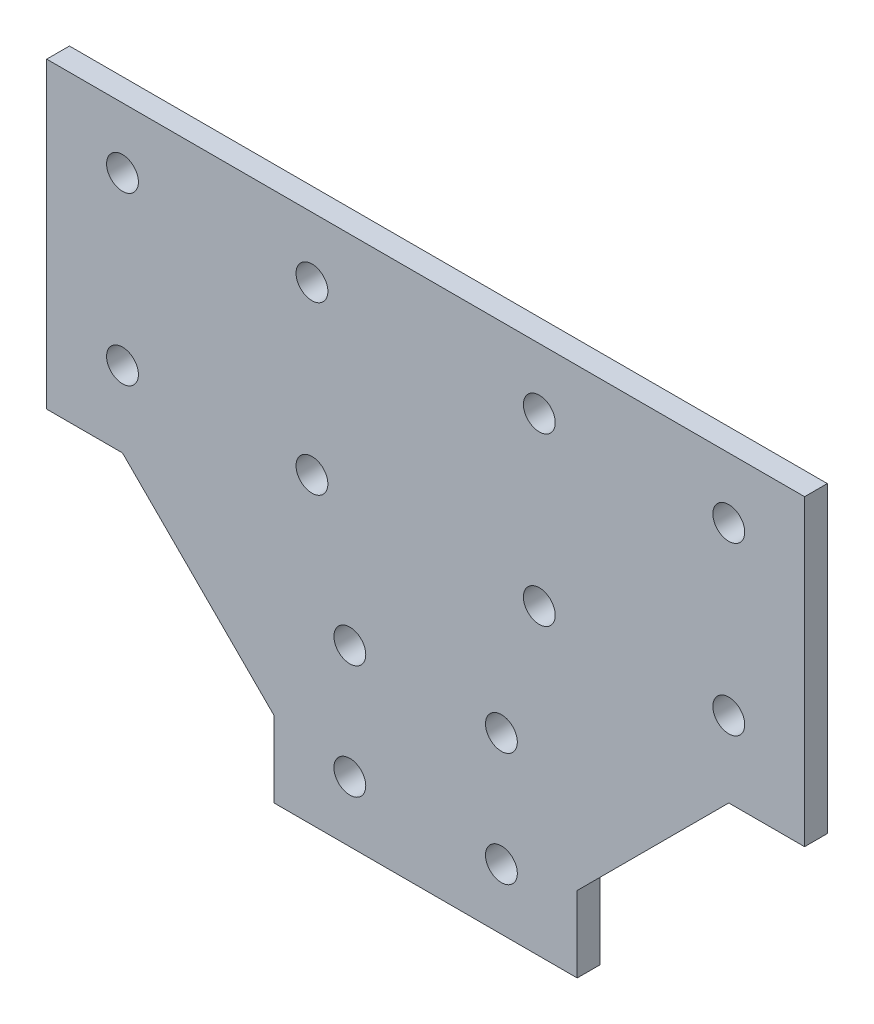
ISO-10303-21;
HEADER;
FILE_DESCRIPTION(('STEP AP214'),'2;1');
FILE_NAME('part.step','',(''),(''),'','','');
FILE_SCHEMA(('AUTOMOTIVE_DESIGN { 1 0 10303 214 1 1 1 1 }'));
ENDSEC;
DATA;
#1=APPLICATION_CONTEXT('core data for automotive mechanical design processes');
#2=APPLICATION_PROTOCOL_DEFINITION('international standard','automotive_design',2000,#1);
#3=PRODUCT_CONTEXT('',#1,'mechanical');
#4=PRODUCT('Part','Part','',(#3));
#5=PRODUCT_RELATED_PRODUCT_CATEGORY('part','',(#4));
#6=PRODUCT_DEFINITION_FORMATION('','',#4);
#7=PRODUCT_DEFINITION_CONTEXT('part definition',#1,'design');
#8=PRODUCT_DEFINITION('design','',#6,#7);
#9=PRODUCT_DEFINITION_SHAPE('','',#8);
#10=(LENGTH_UNIT() NAMED_UNIT(*) SI_UNIT(.MILLI.,.METRE.));
#11=(NAMED_UNIT(*) PLANE_ANGLE_UNIT() SI_UNIT($,.RADIAN.));
#12=(NAMED_UNIT(*) SI_UNIT($,.STERADIAN.) SOLID_ANGLE_UNIT());
#13=UNCERTAINTY_MEASURE_WITH_UNIT(LENGTH_MEASURE(1.E-05),#10,'distance_accuracy_value','');
#14=(GEOMETRIC_REPRESENTATION_CONTEXT(3) GLOBAL_UNCERTAINTY_ASSIGNED_CONTEXT((#13)) GLOBAL_UNIT_ASSIGNED_CONTEXT((#10,
#11,#12)) REPRESENTATION_CONTEXT('',''));
#15=CARTESIAN_POINT('',(0.,0.,0.));
#16=DIRECTION('',(0.,0.,1.));
#17=DIRECTION('',(1.,0.,0.));
#18=AXIS2_PLACEMENT_3D('',#15,#16,#17);
#19=CARTESIAN_POINT('',(-9.99999999999996,-10.,3.));
#20=DIRECTION('',(0.707106781186546,0.707106781186549,0.));
#21=DIRECTION('',(-0.707106781186549,0.707106781186546,0.));
#22=AXIS2_PLACEMENT_3D('',#19,#20,#21);
#23=PLANE('',#22);
#24=DIRECTION('',(0.707106781186549,-0.707106781186546,0.));
#25=VECTOR('',#24,1.);
#26=CARTESIAN_POINT('',(-9.99999999999996,-10.,0.));
#27=LINE('',#26,#25);
#28=CARTESIAN_POINT('',(-20.,0.,0.));
#29=VERTEX_POINT('',#28);
#30=CARTESIAN_POINT('',(0.,-19.9999999999999,0.));
#31=VERTEX_POINT('',#30);
#32=EDGE_CURVE('E141',#29,#31,#27,.T.);
#33=ORIENTED_EDGE('',*,*,#32,.T.);
#34=DIRECTION('',(0.,0.,-1.));
#35=VECTOR('',#34,1.);
#36=CARTESIAN_POINT('',(0.,-19.9999999999999,3.));
#37=LINE('',#36,#35);
#38=CARTESIAN_POINT('',(0.,-19.9999999999999,3.));
#39=VERTEX_POINT('',#38);
#40=EDGE_CURVE('E11',#39,#31,#37,.T.);
#41=ORIENTED_EDGE('',*,*,#40,.F.);
#42=DIRECTION('',(0.707106781186549,-0.707106781186546,0.));
#43=VECTOR('',#42,1.);
#44=CARTESIAN_POINT('',(-9.99999999999996,-10.,3.));
#45=LINE('',#44,#43);
#46=CARTESIAN_POINT('',(-20.,0.,3.));
#47=VERTEX_POINT('',#46);
#48=EDGE_CURVE('E93',#47,#39,#45,.T.);
#49=ORIENTED_EDGE('',*,*,#48,.F.);
#50=DIRECTION('',(0.,0.,-1.));
#51=VECTOR('',#50,1.);
#52=CARTESIAN_POINT('',(-20.,0.,3.));
#53=LINE('',#52,#51);
#54=EDGE_CURVE('E50',#47,#29,#53,.T.);
#55=ORIENTED_EDGE('',*,*,#54,.T.);
#56=EDGE_LOOP('',(#33,#41,#49,#55));
#57=FACE_BOUND('',#56,.T.);
#58=ADVANCED_FACE('F34',(#57),#23,.F.);
#59=CARTESIAN_POINT('',(0.,0.,3.));
#60=DIRECTION('',(-1.,0.,0.));
#61=DIRECTION('',(0.,-1.,0.));
#62=AXIS2_PLACEMENT_3D('',#59,#60,#61);
#63=PLANE('',#62);
#64=DIRECTION('',(0.,1.,0.));
#65=VECTOR('',#64,1.);
#66=CARTESIAN_POINT('',(0.,0.,0.));
#67=LINE('',#66,#65);
#68=CARTESIAN_POINT('',(0.,-30.,0.));
#69=VERTEX_POINT('',#68);
#70=EDGE_CURVE('E143',#69,#31,#67,.T.);
#71=ORIENTED_EDGE('',*,*,#70,.F.);
#72=DIRECTION('',(0.,0.,-1.));
#73=VECTOR('',#72,1.);
#74=CARTESIAN_POINT('',(0.,-30.,3.));
#75=LINE('',#74,#73);
#76=CARTESIAN_POINT('',(0.,-30.,3.));
#77=VERTEX_POINT('',#76);
#78=EDGE_CURVE('E42',#77,#69,#75,.T.);
#79=ORIENTED_EDGE('',*,*,#78,.F.);
#80=DIRECTION('',(0.,1.,0.));
#81=VECTOR('',#80,1.);
#82=CARTESIAN_POINT('',(0.,0.,3.));
#83=LINE('',#82,#81);
#84=EDGE_CURVE('E198',#77,#39,#83,.T.);
#85=ORIENTED_EDGE('',*,*,#84,.T.);
#86=ORIENTED_EDGE('',*,*,#40,.T.);
#87=EDGE_LOOP('',(#71,#79,#85,#86));
#88=FACE_BOUND('',#87,.T.);
#89=ADVANCED_FACE('F187',(#88),#63,.T.);
#90=CARTESIAN_POINT('',(0.,-30.,3.));
#91=DIRECTION('',(0.,-1.,0.));
#92=DIRECTION('',(1.,0.,0.));
#93=AXIS2_PLACEMENT_3D('',#90,#91,#92);
#94=PLANE('',#93);
#95=DIRECTION('',(-1.,0.,0.));
#96=VECTOR('',#95,1.);
#97=CARTESIAN_POINT('',(0.,-30.,0.));
#98=LINE('',#97,#96);
#99=CARTESIAN_POINT('',(40.,-30.,0.));
#100=VERTEX_POINT('',#99);
#101=EDGE_CURVE('E147',#100,#69,#98,.T.);
#102=ORIENTED_EDGE('',*,*,#101,.F.);
#103=DIRECTION('',(0.,0.,-1.));
#104=VECTOR('',#103,1.);
#105=CARTESIAN_POINT('',(40.,-30.,3.));
#106=LINE('',#105,#104);
#107=CARTESIAN_POINT('',(40.,-30.,3.));
#108=VERTEX_POINT('',#107);
#109=EDGE_CURVE('E177',#108,#100,#106,.T.);
#110=ORIENTED_EDGE('',*,*,#109,.F.);
#111=DIRECTION('',(-1.,0.,0.));
#112=VECTOR('',#111,1.);
#113=CARTESIAN_POINT('',(0.,-30.,3.));
#114=LINE('',#113,#112);
#115=EDGE_CURVE('E184',#108,#77,#114,.T.);
#116=ORIENTED_EDGE('',*,*,#115,.T.);
#117=ORIENTED_EDGE('',*,*,#78,.T.);
#118=EDGE_LOOP('',(#102,#110,#116,#117));
#119=FACE_BOUND('',#118,.T.);
#120=ADVANCED_FACE('F182',(#119),#94,.T.);
#121=CARTESIAN_POINT('',(40.,0.,3.));
#122=DIRECTION('',(1.,0.,0.));
#123=DIRECTION('',(0.,1.,0.));
#124=AXIS2_PLACEMENT_3D('',#121,#122,#123);
#125=PLANE('',#124);
#126=DIRECTION('',(0.,-1.,0.));
#127=VECTOR('',#126,1.);
#128=CARTESIAN_POINT('',(40.,0.,0.));
#129=LINE('',#128,#127);
#130=CARTESIAN_POINT('',(40.,-19.9999999999999,0.));
#131=VERTEX_POINT('',#130);
#132=EDGE_CURVE('E150',#131,#100,#129,.T.);
#133=ORIENTED_EDGE('',*,*,#132,.F.);
#134=DIRECTION('',(0.,0.,-1.));
#135=VECTOR('',#134,1.);
#136=CARTESIAN_POINT('',(40.,-19.9999999999999,3.));
#137=LINE('',#136,#135);
#138=CARTESIAN_POINT('',(40.,-19.9999999999999,3.));
#139=VERTEX_POINT('',#138);
#140=EDGE_CURVE('E175',#139,#131,#137,.T.);
#141=ORIENTED_EDGE('',*,*,#140,.F.);
#142=DIRECTION('',(0.,-1.,0.));
#143=VECTOR('',#142,1.);
#144=CARTESIAN_POINT('',(40.,0.,3.));
#145=LINE('',#144,#143);
#146=EDGE_CURVE('E197',#139,#108,#145,.T.);
#147=ORIENTED_EDGE('',*,*,#146,.T.);
#148=ORIENTED_EDGE('',*,*,#109,.T.);
#149=EDGE_LOOP('',(#133,#141,#147,#148));
#150=FACE_BOUND('',#149,.T.);
#151=ADVANCED_FACE('F193',(#150),#125,.T.);
#152=CARTESIAN_POINT('',(29.9999999999999,-30.,3.));
#153=DIRECTION('',(-0.707106781186546,0.707106781186548,0.));
#154=DIRECTION('',(-0.707106781186549,-0.707106781186546,0.));
#155=AXIS2_PLACEMENT_3D('',#152,#153,#154);
#156=PLANE('',#155);
#157=DIRECTION('',(0.707106781186549,0.707106781186546,0.));
#158=VECTOR('',#157,1.);
#159=CARTESIAN_POINT('',(29.9999999999999,-30.,0.));
#160=LINE('',#159,#158);
#161=CARTESIAN_POINT('',(60.,0.,0.));
#162=VERTEX_POINT('',#161);
#163=EDGE_CURVE('E153',#131,#162,#160,.T.);
#164=ORIENTED_EDGE('',*,*,#163,.T.);
#165=DIRECTION('',(0.,0.,-1.));
#166=VECTOR('',#165,1.);
#167=CARTESIAN_POINT('',(60.,0.,3.));
#168=LINE('',#167,#166);
#169=CARTESIAN_POINT('',(60.,0.,3.));
#170=VERTEX_POINT('',#169);
#171=EDGE_CURVE('E173',#170,#162,#168,.T.);
#172=ORIENTED_EDGE('',*,*,#171,.F.);
#173=DIRECTION('',(0.707106781186549,0.707106781186546,0.));
#174=VECTOR('',#173,1.);
#175=CARTESIAN_POINT('',(29.9999999999999,-30.,3.));
#176=LINE('',#175,#174);
#177=EDGE_CURVE('E200',#139,#170,#176,.T.);
#178=ORIENTED_EDGE('',*,*,#177,.F.);
#179=ORIENTED_EDGE('',*,*,#140,.T.);
#180=EDGE_LOOP('',(#164,#172,#178,#179));
#181=FACE_BOUND('',#180,.T.);
#182=ADVANCED_FACE('F480',(#181),#156,.F.);
#183=CARTESIAN_POINT('',(0.,0.,3.));
#184=DIRECTION('',(0.,-1.,0.));
#185=DIRECTION('',(1.,0.,0.));
#186=AXIS2_PLACEMENT_3D('',#183,#184,#185);
#187=PLANE('',#186);
#188=DIRECTION('',(-1.,0.,0.));
#189=VECTOR('',#188,1.);
#190=CARTESIAN_POINT('',(0.,0.,0.));
#191=LINE('',#190,#189);
#192=CARTESIAN_POINT('',(70.,0.,0.));
#193=VERTEX_POINT('',#192);
#194=EDGE_CURVE('E156',#193,#162,#191,.T.);
#195=ORIENTED_EDGE('',*,*,#194,.F.);
#196=DIRECTION('',(0.,0.,-1.));
#197=VECTOR('',#196,1.);
#198=CARTESIAN_POINT('',(70.,0.,3.));
#199=LINE('',#198,#197);
#200=CARTESIAN_POINT('',(70.,0.,3.));
#201=VERTEX_POINT('',#200);
#202=EDGE_CURVE('E171',#201,#193,#199,.T.);
#203=ORIENTED_EDGE('',*,*,#202,.F.);
#204=DIRECTION('',(-1.,0.,0.));
#205=VECTOR('',#204,1.);
#206=CARTESIAN_POINT('',(0.,0.,3.));
#207=LINE('',#206,#205);
#208=EDGE_CURVE('E206',#201,#170,#207,.T.);
#209=ORIENTED_EDGE('',*,*,#208,.T.);
#210=ORIENTED_EDGE('',*,*,#171,.T.);
#211=EDGE_LOOP('',(#195,#203,#209,#210));
#212=FACE_BOUND('',#211,.T.);
#213=ADVANCED_FACE('F472',(#212),#187,.T.);
#214=CARTESIAN_POINT('',(70.,0.,3.));
#215=DIRECTION('',(1.,0.,0.));
#216=DIRECTION('',(0.,0.,-1.));
#217=AXIS2_PLACEMENT_3D('',#214,#215,#216);
#218=PLANE('',#217);
#219=DIRECTION('',(0.,-1.,0.));
#220=VECTOR('',#219,1.);
#221=CARTESIAN_POINT('',(70.,0.,0.));
#222=LINE('',#221,#220);
#223=CARTESIAN_POINT('',(70.,40.,0.));
#224=VERTEX_POINT('',#223);
#225=EDGE_CURVE('E159',#224,#193,#222,.T.);
#226=ORIENTED_EDGE('',*,*,#225,.F.);
#227=DIRECTION('',(0.,0.,-1.));
#228=VECTOR('',#227,1.);
#229=CARTESIAN_POINT('',(70.,40.,3.));
#230=LINE('',#229,#228);
#231=CARTESIAN_POINT('',(70.,40.,3.));
#232=VERTEX_POINT('',#231);
#233=EDGE_CURVE('E125',#232,#224,#230,.T.);
#234=ORIENTED_EDGE('',*,*,#233,.F.);
#235=DIRECTION('',(0.,-1.,0.));
#236=VECTOR('',#235,1.);
#237=CARTESIAN_POINT('',(70.,0.,3.));
#238=LINE('',#237,#236);
#239=EDGE_CURVE('E133',#232,#201,#238,.T.);
#240=ORIENTED_EDGE('',*,*,#239,.T.);
#241=ORIENTED_EDGE('',*,*,#202,.T.);
#242=EDGE_LOOP('',(#226,#234,#240,#241));
#243=FACE_BOUND('',#242,.T.);
#244=ADVANCED_FACE('F210',(#243),#218,.T.);
#245=CARTESIAN_POINT('',(0.,40.,3.));
#246=DIRECTION('',(0.,1.,0.));
#247=DIRECTION('',(0.,0.,1.));
#248=AXIS2_PLACEMENT_3D('',#245,#246,#247);
#249=PLANE('',#248);
#250=DIRECTION('',(1.,0.,0.));
#251=VECTOR('',#250,1.);
#252=CARTESIAN_POINT('',(0.,40.,0.));
#253=LINE('',#252,#251);
#254=CARTESIAN_POINT('',(-30.,40.,0.));
#255=VERTEX_POINT('',#254);
#256=EDGE_CURVE('E121',#255,#224,#253,.T.);
#257=ORIENTED_EDGE('',*,*,#256,.F.);
#258=DIRECTION('',(0.,0.,-1.));
#259=VECTOR('',#258,1.);
#260=CARTESIAN_POINT('',(-30.,40.,3.));
#261=LINE('',#260,#259);
#262=CARTESIAN_POINT('',(-30.,40.,3.));
#263=VERTEX_POINT('',#262);
#264=EDGE_CURVE('E116',#263,#255,#261,.T.);
#265=ORIENTED_EDGE('',*,*,#264,.F.);
#266=DIRECTION('',(1.,0.,0.));
#267=VECTOR('',#266,1.);
#268=CARTESIAN_POINT('',(0.,40.,3.));
#269=LINE('',#268,#267);
#270=EDGE_CURVE('E119',#263,#232,#269,.T.);
#271=ORIENTED_EDGE('',*,*,#270,.T.);
#272=ORIENTED_EDGE('',*,*,#233,.T.);
#273=EDGE_LOOP('',(#257,#265,#271,#272));
#274=FACE_BOUND('',#273,.T.);
#275=ADVANCED_FACE('F118',(#274),#249,.T.);
#276=CARTESIAN_POINT('',(-30.,0.,3.));
#277=DIRECTION('',(-1.,0.,0.));
#278=DIRECTION('',(0.,0.,1.));
#279=AXIS2_PLACEMENT_3D('',#276,#277,#278);
#280=PLANE('',#279);
#281=DIRECTION('',(0.,1.,0.));
#282=VECTOR('',#281,1.);
#283=CARTESIAN_POINT('',(-30.,0.,0.));
#284=LINE('',#283,#282);
#285=CARTESIAN_POINT('',(-30.,0.,0.));
#286=VERTEX_POINT('',#285);
#287=EDGE_CURVE('E163',#286,#255,#284,.T.);
#288=ORIENTED_EDGE('',*,*,#287,.F.);
#289=DIRECTION('',(0.,0.,-1.));
#290=VECTOR('',#289,1.);
#291=CARTESIAN_POINT('',(-30.,0.,3.));
#292=LINE('',#291,#290);
#293=CARTESIAN_POINT('',(-30.,0.,3.));
#294=VERTEX_POINT('',#293);
#295=EDGE_CURVE('E81',#294,#286,#292,.T.);
#296=ORIENTED_EDGE('',*,*,#295,.F.);
#297=DIRECTION('',(0.,1.,0.));
#298=VECTOR('',#297,1.);
#299=CARTESIAN_POINT('',(-30.,0.,3.));
#300=LINE('',#299,#298);
#301=EDGE_CURVE('E130',#294,#263,#300,.T.);
#302=ORIENTED_EDGE('',*,*,#301,.T.);
#303=ORIENTED_EDGE('',*,*,#264,.T.);
#304=EDGE_LOOP('',(#288,#296,#302,#303));
#305=FACE_BOUND('',#304,.T.);
#306=ADVANCED_FACE('F135',(#305),#280,.T.);
#307=CARTESIAN_POINT('',(0.,0.,3.));
#308=DIRECTION('',(0.,-1.,0.));
#309=DIRECTION('',(1.,0.,0.));
#310=AXIS2_PLACEMENT_3D('',#307,#308,#309);
#311=PLANE('',#310);
#312=DIRECTION('',(-1.,0.,0.));
#313=VECTOR('',#312,1.);
#314=CARTESIAN_POINT('',(0.,0.,0.));
#315=LINE('',#314,#313);
#316=EDGE_CURVE('E165',#29,#286,#315,.T.);
#317=ORIENTED_EDGE('',*,*,#316,.F.);
#318=ORIENTED_EDGE('',*,*,#54,.F.);
#319=DIRECTION('',(-1.,0.,0.));
#320=VECTOR('',#319,1.);
#321=CARTESIAN_POINT('',(0.,0.,3.));
#322=LINE('',#321,#320);
#323=EDGE_CURVE('E136',#47,#294,#322,.T.);
#324=ORIENTED_EDGE('',*,*,#323,.T.);
#325=ORIENTED_EDGE('',*,*,#295,.T.);
#326=EDGE_LOOP('',(#317,#318,#324,#325));
#327=FACE_BOUND('',#326,.T.);
#328=ADVANCED_FACE('F212',(#327),#311,.T.);
#329=CARTESIAN_POINT('',(0.,0.,3.));
#330=DIRECTION('',(0.,0.,1.));
#331=DIRECTION('',(1.,0.,0.));
#332=AXIS2_PLACEMENT_3D('',#329,#330,#331);
#333=PLANE('',#332);
#334=CARTESIAN_POINT('',(60.,10.,3.));
#335=DIRECTION('',(0.,0.,1.));
#336=DIRECTION('',(1.,0.,0.));
#337=AXIS2_PLACEMENT_3D('',#334,#335,#336);
#338=CIRCLE('',#337,2.1);
#339=CARTESIAN_POINT('',(62.1,10.,3.));
#340=VERTEX_POINT('',#339);
#341=EDGE_CURVE('E258',#340,#340,#338,.T.);
#342=ORIENTED_EDGE('',*,*,#341,.F.);
#343=EDGE_LOOP('',(#342));
#344=FACE_BOUND('',#343,.T.);
#345=CARTESIAN_POINT('',(35.,10.,3.));
#346=DIRECTION('',(0.,0.,1.));
#347=DIRECTION('',(1.,0.,0.));
#348=AXIS2_PLACEMENT_3D('',#345,#346,#347);
#349=CIRCLE('',#348,2.1);
#350=CARTESIAN_POINT('',(37.1,10.,3.));
#351=VERTEX_POINT('',#350);
#352=EDGE_CURVE('E265',#351,#351,#349,.T.);
#353=ORIENTED_EDGE('',*,*,#352,.F.);
#354=EDGE_LOOP('',(#353));
#355=FACE_BOUND('',#354,.T.);
#356=CARTESIAN_POINT('',(5.00000000000001,10.,3.));
#357=DIRECTION('',(0.,0.,1.));
#358=DIRECTION('',(1.,0.,0.));
#359=AXIS2_PLACEMENT_3D('',#356,#357,#358);
#360=CIRCLE('',#359,2.1);
#361=CARTESIAN_POINT('',(7.10000000000001,10.,3.));
#362=VERTEX_POINT('',#361);
#363=EDGE_CURVE('E271',#362,#362,#360,.T.);
#364=ORIENTED_EDGE('',*,*,#363,.F.);
#365=EDGE_LOOP('',(#364));
#366=FACE_BOUND('',#365,.T.);
#367=CARTESIAN_POINT('',(-20.,32.,3.));
#368=DIRECTION('',(0.,0.,1.));
#369=DIRECTION('',(1.,0.,0.));
#370=AXIS2_PLACEMENT_3D('',#367,#368,#369);
#371=CIRCLE('',#370,2.1);
#372=CARTESIAN_POINT('',(-17.9,32.,3.));
#373=VERTEX_POINT('',#372);
#374=EDGE_CURVE('E277',#373,#373,#371,.T.);
#375=ORIENTED_EDGE('',*,*,#374,.F.);
#376=EDGE_LOOP('',(#375));
#377=FACE_BOUND('',#376,.T.);
#378=CARTESIAN_POINT('',(30.,-7.,3.));
#379=DIRECTION('',(0.,0.,1.));
#380=DIRECTION('',(1.,0.,0.));
#381=AXIS2_PLACEMENT_3D('',#378,#379,#380);
#382=CIRCLE('',#381,2.1);
#383=CARTESIAN_POINT('',(32.1,-7.,3.));
#384=VERTEX_POINT('',#383);
#385=EDGE_CURVE('E241',#384,#384,#382,.T.);
#386=ORIENTED_EDGE('',*,*,#385,.F.);
#387=EDGE_LOOP('',(#386));
#388=FACE_BOUND('',#387,.T.);
#389=CARTESIAN_POINT('',(10.,-22.,3.));
#390=DIRECTION('',(0.,0.,1.));
#391=DIRECTION('',(1.,0.,0.));
#392=AXIS2_PLACEMENT_3D('',#389,#390,#391);
#393=CIRCLE('',#392,2.1);
#394=CARTESIAN_POINT('',(12.1,-22.,3.));
#395=VERTEX_POINT('',#394);
#396=EDGE_CURVE('E234',#395,#395,#393,.T.);
#397=ORIENTED_EDGE('',*,*,#396,.F.);
#398=EDGE_LOOP('',(#397));
#399=FACE_BOUND('',#398,.T.);
#400=CARTESIAN_POINT('',(30.,-22.,3.));
#401=DIRECTION('',(0.,0.,1.));
#402=DIRECTION('',(1.,0.,0.));
#403=AXIS2_PLACEMENT_3D('',#400,#401,#402);
#404=CIRCLE('',#403,2.1);
#405=CARTESIAN_POINT('',(32.1,-22.,3.));
#406=VERTEX_POINT('',#405);
#407=EDGE_CURVE('E253',#406,#406,#404,.T.);
#408=ORIENTED_EDGE('',*,*,#407,.F.);
#409=EDGE_LOOP('',(#408));
#410=FACE_BOUND('',#409,.T.);
#411=CARTESIAN_POINT('',(-20.,10.,3.));
#412=DIRECTION('',(0.,0.,1.));
#413=DIRECTION('',(1.,0.,0.));
#414=AXIS2_PLACEMENT_3D('',#411,#412,#413);
#415=CIRCLE('',#414,2.1);
#416=CARTESIAN_POINT('',(-17.9,10.,3.));
#417=VERTEX_POINT('',#416);
#418=EDGE_CURVE('E246',#417,#417,#415,.T.);
#419=ORIENTED_EDGE('',*,*,#418,.F.);
#420=EDGE_LOOP('',(#419));
#421=FACE_BOUND('',#420,.T.);
#422=CARTESIAN_POINT('',(60.,32.,3.));
#423=DIRECTION('',(0.,0.,1.));
#424=DIRECTION('',(1.,0.,0.));
#425=AXIS2_PLACEMENT_3D('',#422,#423,#424);
#426=CIRCLE('',#425,2.1);
#427=CARTESIAN_POINT('',(62.1,32.,3.));
#428=VERTEX_POINT('',#427);
#429=EDGE_CURVE('E294',#428,#428,#426,.T.);
#430=ORIENTED_EDGE('',*,*,#429,.F.);
#431=EDGE_LOOP('',(#430));
#432=FACE_BOUND('',#431,.T.);
#433=CARTESIAN_POINT('',(35.,32.,3.));
#434=DIRECTION('',(0.,0.,1.));
#435=DIRECTION('',(1.,0.,0.));
#436=AXIS2_PLACEMENT_3D('',#433,#434,#435);
#437=CIRCLE('',#436,2.1);
#438=CARTESIAN_POINT('',(37.1,32.,3.));
#439=VERTEX_POINT('',#438);
#440=EDGE_CURVE('E288',#439,#439,#437,.T.);
#441=ORIENTED_EDGE('',*,*,#440,.F.);
#442=EDGE_LOOP('',(#441));
#443=FACE_BOUND('',#442,.T.);
#444=CARTESIAN_POINT('',(5.,32.,3.));
#445=DIRECTION('',(0.,0.,1.));
#446=DIRECTION('',(1.,0.,0.));
#447=AXIS2_PLACEMENT_3D('',#444,#445,#446);
#448=CIRCLE('',#447,2.1);
#449=CARTESIAN_POINT('',(7.1,32.,3.));
#450=VERTEX_POINT('',#449);
#451=EDGE_CURVE('E282',#450,#450,#448,.T.);
#452=ORIENTED_EDGE('',*,*,#451,.F.);
#453=EDGE_LOOP('',(#452));
#454=FACE_BOUND('',#453,.T.);
#455=CARTESIAN_POINT('',(10.,-7.,3.));
#456=DIRECTION('',(0.,0.,1.));
#457=DIRECTION('',(1.,0.,0.));
#458=AXIS2_PLACEMENT_3D('',#455,#456,#457);
#459=CIRCLE('',#458,2.1);
#460=CARTESIAN_POINT('',(12.1,-7.,3.));
#461=VERTEX_POINT('',#460);
#462=EDGE_CURVE('E228',#461,#461,#459,.T.);
#463=ORIENTED_EDGE('',*,*,#462,.F.);
#464=EDGE_LOOP('',(#463));
#465=FACE_BOUND('',#464,.T.);
#466=ORIENTED_EDGE('',*,*,#48,.T.);
#467=ORIENTED_EDGE('',*,*,#84,.F.);
#468=ORIENTED_EDGE('',*,*,#115,.F.);
#469=ORIENTED_EDGE('',*,*,#146,.F.);
#470=ORIENTED_EDGE('',*,*,#177,.T.);
#471=ORIENTED_EDGE('',*,*,#208,.F.);
#472=ORIENTED_EDGE('',*,*,#239,.F.);
#473=ORIENTED_EDGE('',*,*,#270,.F.);
#474=ORIENTED_EDGE('',*,*,#301,.F.);
#475=ORIENTED_EDGE('',*,*,#323,.F.);
#476=EDGE_LOOP('',(#466,#467,#468,#469,#470,#471,#472,#473,#474,#475));
#477=FACE_BOUND('',#476,.T.);
#478=ADVANCED_FACE('F129',(#344,#355,#366,#377,#388,#399,#410,#421,#432,#443,#454,#465,#477),
#333,.T.);
#479=CARTESIAN_POINT('',(0.,0.,0.));
#480=DIRECTION('',(0.,0.,1.));
#481=DIRECTION('',(1.,0.,0.));
#482=AXIS2_PLACEMENT_3D('',#479,#480,#481);
#483=PLANE('',#482);
#484=CARTESIAN_POINT('',(60.,10.,0.));
#485=DIRECTION('',(0.,0.,1.));
#486=DIRECTION('',(1.,0.,0.));
#487=AXIS2_PLACEMENT_3D('',#484,#485,#486);
#488=CIRCLE('',#487,2.1);
#489=CARTESIAN_POINT('',(62.1,10.,0.));
#490=VERTEX_POINT('',#489);
#491=EDGE_CURVE('E261',#490,#490,#488,.T.);
#492=ORIENTED_EDGE('',*,*,#491,.T.);
#493=EDGE_LOOP('',(#492));
#494=FACE_BOUND('',#493,.T.);
#495=CARTESIAN_POINT('',(35.,10.,0.));
#496=DIRECTION('',(0.,0.,1.));
#497=DIRECTION('',(1.,0.,0.));
#498=AXIS2_PLACEMENT_3D('',#495,#496,#497);
#499=CIRCLE('',#498,2.1);
#500=CARTESIAN_POINT('',(37.1,10.,0.));
#501=VERTEX_POINT('',#500);
#502=EDGE_CURVE('E268',#501,#501,#499,.T.);
#503=ORIENTED_EDGE('',*,*,#502,.T.);
#504=EDGE_LOOP('',(#503));
#505=FACE_BOUND('',#504,.T.);
#506=CARTESIAN_POINT('',(5.00000000000001,10.,0.));
#507=DIRECTION('',(0.,0.,1.));
#508=DIRECTION('',(1.,0.,0.));
#509=AXIS2_PLACEMENT_3D('',#506,#507,#508);
#510=CIRCLE('',#509,2.1);
#511=CARTESIAN_POINT('',(7.10000000000001,10.,0.));
#512=VERTEX_POINT('',#511);
#513=EDGE_CURVE('E274',#512,#512,#510,.T.);
#514=ORIENTED_EDGE('',*,*,#513,.T.);
#515=EDGE_LOOP('',(#514));
#516=FACE_BOUND('',#515,.T.);
#517=CARTESIAN_POINT('',(-20.,32.,0.));
#518=DIRECTION('',(0.,0.,1.));
#519=DIRECTION('',(1.,0.,0.));
#520=AXIS2_PLACEMENT_3D('',#517,#518,#519);
#521=CIRCLE('',#520,2.1);
#522=CARTESIAN_POINT('',(-17.9,32.,0.));
#523=VERTEX_POINT('',#522);
#524=EDGE_CURVE('E250',#523,#523,#521,.T.);
#525=ORIENTED_EDGE('',*,*,#524,.T.);
#526=EDGE_LOOP('',(#525));
#527=FACE_BOUND('',#526,.T.);
#528=CARTESIAN_POINT('',(30.,-7.,0.));
#529=DIRECTION('',(0.,0.,1.));
#530=DIRECTION('',(1.,0.,0.));
#531=AXIS2_PLACEMENT_3D('',#528,#529,#530);
#532=CIRCLE('',#531,2.1);
#533=CARTESIAN_POINT('',(32.1,-7.,0.));
#534=VERTEX_POINT('',#533);
#535=EDGE_CURVE('E231',#534,#534,#532,.T.);
#536=ORIENTED_EDGE('',*,*,#535,.T.);
#537=EDGE_LOOP('',(#536));
#538=FACE_BOUND('',#537,.T.);
#539=CARTESIAN_POINT('',(10.,-22.,0.));
#540=DIRECTION('',(0.,0.,1.));
#541=DIRECTION('',(1.,0.,0.));
#542=AXIS2_PLACEMENT_3D('',#539,#540,#541);
#543=CIRCLE('',#542,2.1);
#544=CARTESIAN_POINT('',(12.1,-22.,0.));
#545=VERTEX_POINT('',#544);
#546=EDGE_CURVE('E237',#545,#545,#543,.T.);
#547=ORIENTED_EDGE('',*,*,#546,.T.);
#548=EDGE_LOOP('',(#547));
#549=FACE_BOUND('',#548,.T.);
#550=CARTESIAN_POINT('',(30.,-22.,0.));
#551=DIRECTION('',(0.,0.,1.));
#552=DIRECTION('',(1.,0.,0.));
#553=AXIS2_PLACEMENT_3D('',#550,#551,#552);
#554=CIRCLE('',#553,2.1);
#555=CARTESIAN_POINT('',(32.1,-22.,0.));
#556=VERTEX_POINT('',#555);
#557=EDGE_CURVE('E238',#556,#556,#554,.T.);
#558=ORIENTED_EDGE('',*,*,#557,.T.);
#559=EDGE_LOOP('',(#558));
#560=FACE_BOUND('',#559,.T.);
#561=CARTESIAN_POINT('',(-20.,10.,0.));
#562=DIRECTION('',(0.,0.,1.));
#563=DIRECTION('',(1.,0.,0.));
#564=AXIS2_PLACEMENT_3D('',#561,#562,#563);
#565=CIRCLE('',#564,2.1);
#566=CARTESIAN_POINT('',(-17.9,10.,0.));
#567=VERTEX_POINT('',#566);
#568=EDGE_CURVE('E249',#567,#567,#565,.T.);
#569=ORIENTED_EDGE('',*,*,#568,.T.);
#570=EDGE_LOOP('',(#569));
#571=FACE_BOUND('',#570,.T.);
#572=CARTESIAN_POINT('',(60.,32.,0.));
#573=DIRECTION('',(0.,0.,1.));
#574=DIRECTION('',(1.,0.,0.));
#575=AXIS2_PLACEMENT_3D('',#572,#573,#574);
#576=CIRCLE('',#575,2.1);
#577=CARTESIAN_POINT('',(62.1,32.,0.));
#578=VERTEX_POINT('',#577);
#579=EDGE_CURVE('E262',#578,#578,#576,.T.);
#580=ORIENTED_EDGE('',*,*,#579,.T.);
#581=EDGE_LOOP('',(#580));
#582=FACE_BOUND('',#581,.T.);
#583=CARTESIAN_POINT('',(35.,32.,0.));
#584=DIRECTION('',(0.,0.,1.));
#585=DIRECTION('',(1.,0.,0.));
#586=AXIS2_PLACEMENT_3D('',#583,#584,#585);
#587=CIRCLE('',#586,2.1);
#588=CARTESIAN_POINT('',(37.1,32.,0.));
#589=VERTEX_POINT('',#588);
#590=EDGE_CURVE('E291',#589,#589,#587,.T.);
#591=ORIENTED_EDGE('',*,*,#590,.T.);
#592=EDGE_LOOP('',(#591));
#593=FACE_BOUND('',#592,.T.);
#594=CARTESIAN_POINT('',(5.,32.,0.));
#595=DIRECTION('',(0.,0.,1.));
#596=DIRECTION('',(1.,0.,0.));
#597=AXIS2_PLACEMENT_3D('',#594,#595,#596);
#598=CIRCLE('',#597,2.1);
#599=CARTESIAN_POINT('',(7.1,32.,0.));
#600=VERTEX_POINT('',#599);
#601=EDGE_CURVE('E285',#600,#600,#598,.T.);
#602=ORIENTED_EDGE('',*,*,#601,.T.);
#603=EDGE_LOOP('',(#602));
#604=FACE_BOUND('',#603,.T.);
#605=CARTESIAN_POINT('',(10.,-7.,0.));
#606=DIRECTION('',(0.,0.,1.));
#607=DIRECTION('',(1.,0.,0.));
#608=AXIS2_PLACEMENT_3D('',#605,#606,#607);
#609=CIRCLE('',#608,2.1);
#610=CARTESIAN_POINT('',(12.1,-7.,0.));
#611=VERTEX_POINT('',#610);
#612=EDGE_CURVE('E144',#611,#611,#609,.T.);
#613=ORIENTED_EDGE('',*,*,#612,.T.);
#614=EDGE_LOOP('',(#613));
#615=FACE_BOUND('',#614,.T.);
#616=ORIENTED_EDGE('',*,*,#32,.F.);
#617=ORIENTED_EDGE('',*,*,#316,.T.);
#618=ORIENTED_EDGE('',*,*,#287,.T.);
#619=ORIENTED_EDGE('',*,*,#256,.T.);
#620=ORIENTED_EDGE('',*,*,#225,.T.);
#621=ORIENTED_EDGE('',*,*,#194,.T.);
#622=ORIENTED_EDGE('',*,*,#163,.F.);
#623=ORIENTED_EDGE('',*,*,#132,.T.);
#624=ORIENTED_EDGE('',*,*,#101,.T.);
#625=ORIENTED_EDGE('',*,*,#70,.T.);
#626=EDGE_LOOP('',(#616,#617,#618,#619,#620,#621,#622,#623,#624,#625));
#627=FACE_BOUND('',#626,.T.);
#628=ADVANCED_FACE('F189',(#494,#505,#516,#527,#538,#549,#560,#571,#582,#593,#604,#615,#627),
#483,.F.);
#629=CARTESIAN_POINT('',(10.,-7.,0.));
#630=DIRECTION('',(0.,0.,1.));
#631=DIRECTION('',(1.,0.,0.));
#632=AXIS2_PLACEMENT_3D('',#629,#630,#631);
#633=CYLINDRICAL_SURFACE('',#632,2.1);
#634=ORIENTED_EDGE('',*,*,#612,.F.);
#635=EDGE_LOOP('',(#634));
#636=FACE_BOUND('',#635,.T.);
#637=ORIENTED_EDGE('',*,*,#462,.T.);
#638=EDGE_LOOP('',(#637));
#639=FACE_BOUND('',#638,.T.);
#640=ADVANCED_FACE('F317',(#636,#639),#633,.F.);
#641=CARTESIAN_POINT('',(5.,32.,0.));
#642=DIRECTION('',(0.,0.,1.));
#643=DIRECTION('',(1.,0.,0.));
#644=AXIS2_PLACEMENT_3D('',#641,#642,#643);
#645=CYLINDRICAL_SURFACE('',#644,2.1);
#646=ORIENTED_EDGE('',*,*,#601,.F.);
#647=EDGE_LOOP('',(#646));
#648=FACE_BOUND('',#647,.T.);
#649=ORIENTED_EDGE('',*,*,#451,.T.);
#650=EDGE_LOOP('',(#649));
#651=FACE_BOUND('',#650,.T.);
#652=ADVANCED_FACE('F319',(#648,#651),#645,.F.);
#653=CARTESIAN_POINT('',(35.,32.,0.));
#654=DIRECTION('',(0.,0.,1.));
#655=DIRECTION('',(1.,0.,0.));
#656=AXIS2_PLACEMENT_3D('',#653,#654,#655);
#657=CYLINDRICAL_SURFACE('',#656,2.1);
#658=ORIENTED_EDGE('',*,*,#590,.F.);
#659=EDGE_LOOP('',(#658));
#660=FACE_BOUND('',#659,.T.);
#661=ORIENTED_EDGE('',*,*,#440,.T.);
#662=EDGE_LOOP('',(#661));
#663=FACE_BOUND('',#662,.T.);
#664=ADVANCED_FACE('F306',(#660,#663),#657,.F.);
#665=CARTESIAN_POINT('',(60.,32.,0.));
#666=DIRECTION('',(0.,0.,1.));
#667=DIRECTION('',(1.,0.,0.));
#668=AXIS2_PLACEMENT_3D('',#665,#666,#667);
#669=CYLINDRICAL_SURFACE('',#668,2.1);
#670=ORIENTED_EDGE('',*,*,#579,.F.);
#671=EDGE_LOOP('',(#670));
#672=FACE_BOUND('',#671,.T.);
#673=ORIENTED_EDGE('',*,*,#429,.T.);
#674=EDGE_LOOP('',(#673));
#675=FACE_BOUND('',#674,.T.);
#676=ADVANCED_FACE('F302',(#672,#675),#669,.F.);
#677=CARTESIAN_POINT('',(-20.,10.,0.));
#678=DIRECTION('',(0.,0.,1.));
#679=DIRECTION('',(1.,0.,0.));
#680=AXIS2_PLACEMENT_3D('',#677,#678,#679);
#681=CYLINDRICAL_SURFACE('',#680,2.1);
#682=ORIENTED_EDGE('',*,*,#568,.F.);
#683=EDGE_LOOP('',(#682));
#684=FACE_BOUND('',#683,.T.);
#685=ORIENTED_EDGE('',*,*,#418,.T.);
#686=EDGE_LOOP('',(#685));
#687=FACE_BOUND('',#686,.T.);
#688=ADVANCED_FACE('F305',(#684,#687),#681,.F.);
#689=CARTESIAN_POINT('',(30.,-22.,0.));
#690=DIRECTION('',(0.,0.,1.));
#691=DIRECTION('',(1.,0.,0.));
#692=AXIS2_PLACEMENT_3D('',#689,#690,#691);
#693=CYLINDRICAL_SURFACE('',#692,2.1);
#694=ORIENTED_EDGE('',*,*,#557,.F.);
#695=EDGE_LOOP('',(#694));
#696=FACE_BOUND('',#695,.T.);
#697=ORIENTED_EDGE('',*,*,#407,.T.);
#698=EDGE_LOOP('',(#697));
#699=FACE_BOUND('',#698,.T.);
#700=ADVANCED_FACE('F335',(#696,#699),#693,.F.);
#701=CARTESIAN_POINT('',(10.,-22.,0.));
#702=DIRECTION('',(0.,0.,1.));
#703=DIRECTION('',(1.,0.,0.));
#704=AXIS2_PLACEMENT_3D('',#701,#702,#703);
#705=CYLINDRICAL_SURFACE('',#704,2.1);
#706=ORIENTED_EDGE('',*,*,#546,.F.);
#707=EDGE_LOOP('',(#706));
#708=FACE_BOUND('',#707,.T.);
#709=ORIENTED_EDGE('',*,*,#396,.T.);
#710=EDGE_LOOP('',(#709));
#711=FACE_BOUND('',#710,.T.);
#712=ADVANCED_FACE('F331',(#708,#711),#705,.F.);
#713=CARTESIAN_POINT('',(30.,-7.,0.));
#714=DIRECTION('',(0.,0.,1.));
#715=DIRECTION('',(1.,0.,0.));
#716=AXIS2_PLACEMENT_3D('',#713,#714,#715);
#717=CYLINDRICAL_SURFACE('',#716,2.1);
#718=ORIENTED_EDGE('',*,*,#535,.F.);
#719=EDGE_LOOP('',(#718));
#720=FACE_BOUND('',#719,.T.);
#721=ORIENTED_EDGE('',*,*,#385,.T.);
#722=EDGE_LOOP('',(#721));
#723=FACE_BOUND('',#722,.T.);
#724=ADVANCED_FACE('F334',(#720,#723),#717,.F.);
#725=CARTESIAN_POINT('',(-20.,32.,0.));
#726=DIRECTION('',(0.,0.,1.));
#727=DIRECTION('',(1.,0.,0.));
#728=AXIS2_PLACEMENT_3D('',#725,#726,#727);
#729=CYLINDRICAL_SURFACE('',#728,2.1);
#730=ORIENTED_EDGE('',*,*,#524,.F.);
#731=EDGE_LOOP('',(#730));
#732=FACE_BOUND('',#731,.T.);
#733=ORIENTED_EDGE('',*,*,#374,.T.);
#734=EDGE_LOOP('',(#733));
#735=FACE_BOUND('',#734,.T.);
#736=ADVANCED_FACE('F339',(#732,#735),#729,.F.);
#737=CARTESIAN_POINT('',(5.00000000000001,10.,0.));
#738=DIRECTION('',(0.,0.,1.));
#739=DIRECTION('',(1.,0.,0.));
#740=AXIS2_PLACEMENT_3D('',#737,#738,#739);
#741=CYLINDRICAL_SURFACE('',#740,2.1);
#742=ORIENTED_EDGE('',*,*,#513,.F.);
#743=EDGE_LOOP('',(#742));
#744=FACE_BOUND('',#743,.T.);
#745=ORIENTED_EDGE('',*,*,#363,.T.);
#746=EDGE_LOOP('',(#745));
#747=FACE_BOUND('',#746,.T.);
#748=ADVANCED_FACE('F354',(#744,#747),#741,.F.);
#749=CARTESIAN_POINT('',(35.,10.,0.));
#750=DIRECTION('',(0.,0.,1.));
#751=DIRECTION('',(1.,0.,0.));
#752=AXIS2_PLACEMENT_3D('',#749,#750,#751);
#753=CYLINDRICAL_SURFACE('',#752,2.1);
#754=ORIENTED_EDGE('',*,*,#502,.F.);
#755=EDGE_LOOP('',(#754));
#756=FACE_BOUND('',#755,.T.);
#757=ORIENTED_EDGE('',*,*,#352,.T.);
#758=EDGE_LOOP('',(#757));
#759=FACE_BOUND('',#758,.T.);
#760=ADVANCED_FACE('F350',(#756,#759),#753,.F.);
#761=CARTESIAN_POINT('',(60.,10.,0.));
#762=DIRECTION('',(0.,0.,1.));
#763=DIRECTION('',(1.,0.,0.));
#764=AXIS2_PLACEMENT_3D('',#761,#762,#763);
#765=CYLINDRICAL_SURFACE('',#764,2.1);
#766=ORIENTED_EDGE('',*,*,#491,.F.);
#767=EDGE_LOOP('',(#766));
#768=FACE_BOUND('',#767,.T.);
#769=ORIENTED_EDGE('',*,*,#341,.T.);
#770=EDGE_LOOP('',(#769));
#771=FACE_BOUND('',#770,.T.);
#772=ADVANCED_FACE('F347',(#768,#771),#765,.F.);
#773=CLOSED_SHELL('',(#58,#89,#120,#151,#182,#213,#244,#275,#306,#328,#478,#628,#640,#652,#664,
#676,#688,#700,#712,#724,#736,#748,#760,#772));
#774=MANIFOLD_SOLID_BREP('B2',#773);
#775=ADVANCED_BREP_SHAPE_REPRESENTATION('',(#18,#774),#14);
#776=SHAPE_DEFINITION_REPRESENTATION(#9,#775);
ENDSEC;
END-ISO-10303-21;
